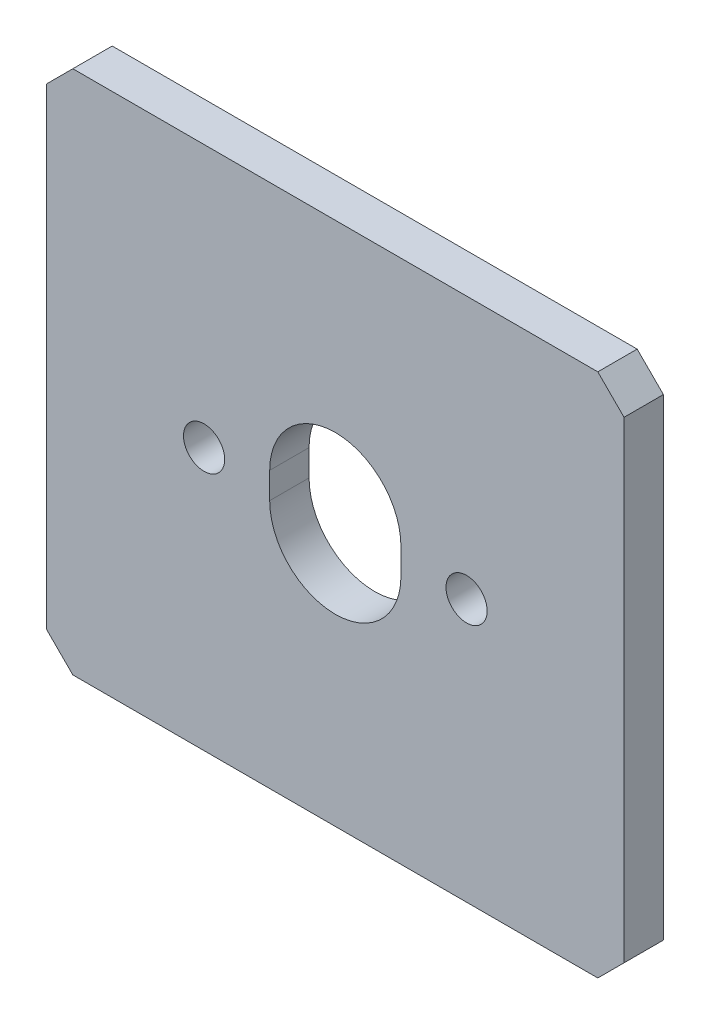
ISO-10303-21;
HEADER;
FILE_DESCRIPTION(('STEP AP214'),'2;1');
FILE_NAME('part.step','',(''),(''),'','','');
FILE_SCHEMA(('AUTOMOTIVE_DESIGN { 1 0 10303 214 1 1 1 1 }'));
ENDSEC;
DATA;
#1=APPLICATION_CONTEXT('core data for automotive mechanical design processes');
#2=APPLICATION_PROTOCOL_DEFINITION('international standard','automotive_design',2000,#1);
#3=PRODUCT_CONTEXT('',#1,'mechanical');
#4=PRODUCT('Part','Part','',(#3));
#5=PRODUCT_RELATED_PRODUCT_CATEGORY('part','',(#4));
#6=PRODUCT_DEFINITION_FORMATION('','',#4);
#7=PRODUCT_DEFINITION_CONTEXT('part definition',#1,'design');
#8=PRODUCT_DEFINITION('design','',#6,#7);
#9=PRODUCT_DEFINITION_SHAPE('','',#8);
#10=(LENGTH_UNIT() NAMED_UNIT(*) SI_UNIT(.MILLI.,.METRE.));
#11=(NAMED_UNIT(*) PLANE_ANGLE_UNIT() SI_UNIT($,.RADIAN.));
#12=(NAMED_UNIT(*) SI_UNIT($,.STERADIAN.) SOLID_ANGLE_UNIT());
#13=UNCERTAINTY_MEASURE_WITH_UNIT(LENGTH_MEASURE(1.E-05),#10,'distance_accuracy_value','');
#14=(GEOMETRIC_REPRESENTATION_CONTEXT(3) GLOBAL_UNCERTAINTY_ASSIGNED_CONTEXT((#13)) GLOBAL_UNIT_ASSIGNED_CONTEXT((#10,
#11,#12)) REPRESENTATION_CONTEXT('',''));
#15=CARTESIAN_POINT('',(0.,0.,0.));
#16=DIRECTION('',(0.,0.,1.));
#17=DIRECTION('',(1.,0.,0.));
#18=AXIS2_PLACEMENT_3D('',#15,#16,#17);
#19=CARTESIAN_POINT('',(0.,0.,-4.7625));
#20=DIRECTION('',(0.,0.,1.));
#21=DIRECTION('',(-1.,0.,0.));
#22=AXIS2_PLACEMENT_3D('',#19,#20,#21);
#23=PLANE('',#22);
#24=DIRECTION('',(0.,-1.,0.));
#25=VECTOR('',#24,1.);
#26=CARTESIAN_POINT('',(-34.925,-31.75,-4.7625));
#27=LINE('',#26,#25);
#28=CARTESIAN_POINT('',(-34.925,28.575,-4.7625));
#29=VERTEX_POINT('',#28);
#30=CARTESIAN_POINT('',(-34.925,-28.575,-4.7625));
#31=VERTEX_POINT('',#30);
#32=EDGE_CURVE('E177',#29,#31,#27,.T.);
#33=ORIENTED_EDGE('',*,*,#32,.F.);
#34=DIRECTION('',(0.707106781186549,0.707106781186546,0.));
#35=VECTOR('',#34,1.);
#36=CARTESIAN_POINT('',(-34.925,28.575,-4.7625));
#37=LINE('',#36,#35);
#38=CARTESIAN_POINT('',(-31.75,31.75,-4.7625));
#39=VERTEX_POINT('',#38);
#40=EDGE_CURVE('E214',#39,#29,#37,.F.);
#41=ORIENTED_EDGE('',*,*,#40,.F.);
#42=DIRECTION('',(-1.,0.,0.));
#43=VECTOR('',#42,1.);
#44=CARTESIAN_POINT('',(-34.925,31.75,-4.7625));
#45=LINE('',#44,#43);
#46=CARTESIAN_POINT('',(31.75,31.75,-4.7625));
#47=VERTEX_POINT('',#46);
#48=EDGE_CURVE('E174',#47,#39,#45,.T.);
#49=ORIENTED_EDGE('',*,*,#48,.F.);
#50=DIRECTION('',(0.707106781186548,-0.707106781186548,0.));
#51=VECTOR('',#50,1.);
#52=CARTESIAN_POINT('',(31.75,31.75,-4.7625));
#53=LINE('',#52,#51);
#54=CARTESIAN_POINT('',(34.925,28.575,-4.7625));
#55=VERTEX_POINT('',#54);
#56=EDGE_CURVE('E212',#55,#47,#53,.F.);
#57=ORIENTED_EDGE('',*,*,#56,.F.);
#58=DIRECTION('',(0.,1.,0.));
#59=VECTOR('',#58,1.);
#60=CARTESIAN_POINT('',(34.925,-31.75,-4.7625));
#61=LINE('',#60,#59);
#62=CARTESIAN_POINT('',(34.925,-28.575,-4.7625));
#63=VERTEX_POINT('',#62);
#64=EDGE_CURVE('E171',#63,#55,#61,.T.);
#65=ORIENTED_EDGE('',*,*,#64,.F.);
#66=DIRECTION('',(-0.707106781186551,-0.707106781186544,0.));
#67=VECTOR('',#66,1.);
#68=CARTESIAN_POINT('',(34.925,-28.575,-4.7625));
#69=LINE('',#68,#67);
#70=CARTESIAN_POINT('',(31.75,-31.75,-4.7625));
#71=VERTEX_POINT('',#70);
#72=EDGE_CURVE('E216',#71,#63,#69,.F.);
#73=ORIENTED_EDGE('',*,*,#72,.F.);
#74=DIRECTION('',(1.,0.,0.));
#75=VECTOR('',#74,1.);
#76=CARTESIAN_POINT('',(-34.925,-31.75,-4.7625));
#77=LINE('',#76,#75);
#78=CARTESIAN_POINT('',(-31.75,-31.75,-4.7625));
#79=VERTEX_POINT('',#78);
#80=EDGE_CURVE('E180',#79,#71,#77,.T.);
#81=ORIENTED_EDGE('',*,*,#80,.F.);
#82=DIRECTION('',(-0.707106781186546,0.707106781186549,0.));
#83=VECTOR('',#82,1.);
#84=CARTESIAN_POINT('',(-31.75,-31.75,-4.7625));
#85=LINE('',#84,#83);
#86=EDGE_CURVE('E219',#31,#79,#85,.F.);
#87=ORIENTED_EDGE('',*,*,#86,.F.);
#88=EDGE_LOOP('',(#33,#41,#49,#57,#65,#73,#81,#87));
#89=FACE_BOUND('',#88,.T.);
#90=CARTESIAN_POINT('',(0.,1.5875,-4.7625));
#91=DIRECTION('',(0.,0.,1.));
#92=DIRECTION('',(1.,0.,0.));
#93=AXIS2_PLACEMENT_3D('',#90,#91,#92);
#94=CIRCLE('',#93,7.9375);
#95=CARTESIAN_POINT('',(7.9375,1.5875,-4.7625));
#96=VERTEX_POINT('',#95);
#97=CARTESIAN_POINT('',(-7.9375,1.5875,-4.7625));
#98=VERTEX_POINT('',#97);
#99=EDGE_CURVE('E128',#96,#98,#94,.T.);
#100=ORIENTED_EDGE('',*,*,#99,.T.);
#101=DIRECTION('',(0.,-1.,0.));
#102=VECTOR('',#101,1.);
#103=CARTESIAN_POINT('',(-7.9375,1.5875,-4.7625));
#104=LINE('',#103,#102);
#105=CARTESIAN_POINT('',(-7.9375,-1.5875,-4.7625));
#106=VERTEX_POINT('',#105);
#107=EDGE_CURVE('E138',#98,#106,#104,.T.);
#108=ORIENTED_EDGE('',*,*,#107,.T.);
#109=CARTESIAN_POINT('',(0.,-1.5875,-4.7625));
#110=DIRECTION('',(0.,0.,1.));
#111=DIRECTION('',(1.,0.,0.));
#112=AXIS2_PLACEMENT_3D('',#109,#110,#111);
#113=CIRCLE('',#112,7.9375);
#114=CARTESIAN_POINT('',(7.9375,-1.5875,-4.7625));
#115=VERTEX_POINT('',#114);
#116=EDGE_CURVE('E143',#106,#115,#113,.T.);
#117=ORIENTED_EDGE('',*,*,#116,.T.);
#118=DIRECTION('',(0.,1.,0.));
#119=VECTOR('',#118,1.);
#120=CARTESIAN_POINT('',(7.9375,1.5875,-4.7625));
#121=LINE('',#120,#119);
#122=EDGE_CURVE('E148',#115,#96,#121,.T.);
#123=ORIENTED_EDGE('',*,*,#122,.T.);
#124=EDGE_LOOP('',(#100,#108,#117,#123));
#125=FACE_BOUND('',#124,.T.);
#126=CARTESIAN_POINT('',(-15.875,0.,-4.7625));
#127=DIRECTION('',(0.,0.,1.));
#128=DIRECTION('',(1.,0.,0.));
#129=AXIS2_PLACEMENT_3D('',#126,#127,#128);
#130=CIRCLE('',#129,2.4892);
#131=CARTESIAN_POINT('',(-18.3642,0.,-4.7625));
#132=VERTEX_POINT('',#131);
#133=EDGE_CURVE('E163',#132,#132,#130,.T.);
#134=ORIENTED_EDGE('',*,*,#133,.T.);
#135=EDGE_LOOP('',(#134));
#136=FACE_BOUND('',#135,.T.);
#137=CARTESIAN_POINT('',(15.875,0.,-4.7625));
#138=DIRECTION('',(0.,0.,1.));
#139=DIRECTION('',(1.,0.,0.));
#140=AXIS2_PLACEMENT_3D('',#137,#138,#139);
#141=CIRCLE('',#140,2.4892);
#142=CARTESIAN_POINT('',(13.3858,0.,-4.7625));
#143=VERTEX_POINT('',#142);
#144=EDGE_CURVE('E397',#143,#143,#141,.T.);
#145=ORIENTED_EDGE('',*,*,#144,.T.);
#146=EDGE_LOOP('',(#145));
#147=FACE_BOUND('',#146,.T.);
#148=ADVANCED_FACE('F37',(#89,#125,#136,#147),#23,.F.);
#149=CARTESIAN_POINT('',(0.,0.,0.));
#150=DIRECTION('',(0.,0.,1.));
#151=DIRECTION('',(-1.,0.,0.));
#152=AXIS2_PLACEMENT_3D('',#149,#150,#151);
#153=PLANE('',#152);
#154=CARTESIAN_POINT('',(-15.875,0.,0.));
#155=DIRECTION('',(0.,0.,1.));
#156=DIRECTION('',(1.,0.,0.));
#157=AXIS2_PLACEMENT_3D('',#154,#155,#156);
#158=CIRCLE('',#157,2.4892);
#159=CARTESIAN_POINT('',(-18.3642,0.,0.));
#160=VERTEX_POINT('',#159);
#161=EDGE_CURVE('E155',#160,#160,#158,.T.);
#162=ORIENTED_EDGE('',*,*,#161,.F.);
#163=EDGE_LOOP('',(#162));
#164=FACE_BOUND('',#163,.T.);
#165=DIRECTION('',(1.,0.,0.));
#166=VECTOR('',#165,1.);
#167=CARTESIAN_POINT('',(-34.925,-31.75,0.));
#168=LINE('',#167,#166);
#169=CARTESIAN_POINT('',(-31.75,-31.75,0.));
#170=VERTEX_POINT('',#169);
#171=CARTESIAN_POINT('',(31.75,-31.75,0.));
#172=VERTEX_POINT('',#171);
#173=EDGE_CURVE('E175',#170,#172,#168,.T.);
#174=ORIENTED_EDGE('',*,*,#173,.T.);
#175=DIRECTION('',(0.707106781186551,0.707106781186544,0.));
#176=VECTOR('',#175,1.);
#177=CARTESIAN_POINT('',(31.7499999999999,-31.7500000000001,0.));
#178=LINE('',#177,#176);
#179=CARTESIAN_POINT('',(34.925,-28.575,0.));
#180=VERTEX_POINT('',#179);
#181=EDGE_CURVE('E202',#180,#172,#178,.F.);
#182=ORIENTED_EDGE('',*,*,#181,.F.);
#183=DIRECTION('',(0.,1.,0.));
#184=VECTOR('',#183,1.);
#185=CARTESIAN_POINT('',(34.925,-31.75,0.));
#186=LINE('',#185,#184);
#187=CARTESIAN_POINT('',(34.925,28.575,0.));
#188=VERTEX_POINT('',#187);
#189=EDGE_CURVE('E134',#180,#188,#186,.T.);
#190=ORIENTED_EDGE('',*,*,#189,.T.);
#191=DIRECTION('',(-0.707106781186548,0.707106781186548,0.));
#192=VECTOR('',#191,1.);
#193=CARTESIAN_POINT('',(31.75,31.75,0.));
#194=LINE('',#193,#192);
#195=CARTESIAN_POINT('',(31.75,31.75,0.));
#196=VERTEX_POINT('',#195);
#197=EDGE_CURVE('E197',#196,#188,#194,.F.);
#198=ORIENTED_EDGE('',*,*,#197,.F.);
#199=DIRECTION('',(-1.,0.,0.));
#200=VECTOR('',#199,1.);
#201=CARTESIAN_POINT('',(-34.925,31.75,0.));
#202=LINE('',#201,#200);
#203=CARTESIAN_POINT('',(-31.75,31.75,0.));
#204=VERTEX_POINT('',#203);
#205=EDGE_CURVE('E186',#196,#204,#202,.T.);
#206=ORIENTED_EDGE('',*,*,#205,.T.);
#207=DIRECTION('',(-0.707106781186549,-0.707106781186546,0.));
#208=VECTOR('',#207,1.);
#209=CARTESIAN_POINT('',(-31.7499999999999,31.7500000000001,0.));
#210=LINE('',#209,#208);
#211=CARTESIAN_POINT('',(-34.925,28.575,0.));
#212=VERTEX_POINT('',#211);
#213=EDGE_CURVE('E200',#212,#204,#210,.F.);
#214=ORIENTED_EDGE('',*,*,#213,.F.);
#215=DIRECTION('',(0.,-1.,0.));
#216=VECTOR('',#215,1.);
#217=CARTESIAN_POINT('',(-34.925,-31.75,0.));
#218=LINE('',#217,#216);
#219=CARTESIAN_POINT('',(-34.925,-28.575,0.));
#220=VERTEX_POINT('',#219);
#221=EDGE_CURVE('E189',#212,#220,#218,.T.);
#222=ORIENTED_EDGE('',*,*,#221,.T.);
#223=DIRECTION('',(0.707106781186546,-0.707106781186549,0.));
#224=VECTOR('',#223,1.);
#225=CARTESIAN_POINT('',(-31.7500000000001,-31.7499999999999,0.));
#226=LINE('',#225,#224);
#227=EDGE_CURVE('E205',#170,#220,#226,.F.);
#228=ORIENTED_EDGE('',*,*,#227,.F.);
#229=EDGE_LOOP('',(#174,#182,#190,#198,#206,#214,#222,#228));
#230=FACE_BOUND('',#229,.T.);
#231=DIRECTION('',(0.,1.,0.));
#232=VECTOR('',#231,1.);
#233=CARTESIAN_POINT('',(7.9375,1.5875,0.));
#234=LINE('',#233,#232);
#235=CARTESIAN_POINT('',(7.9375,-1.5875,0.));
#236=VERTEX_POINT('',#235);
#237=CARTESIAN_POINT('',(7.9375,1.5875,0.));
#238=VERTEX_POINT('',#237);
#239=EDGE_CURVE('E149',#236,#238,#234,.T.);
#240=ORIENTED_EDGE('',*,*,#239,.F.);
#241=CARTESIAN_POINT('',(0.,-1.5875,0.));
#242=DIRECTION('',(0.,0.,1.));
#243=DIRECTION('',(1.,0.,0.));
#244=AXIS2_PLACEMENT_3D('',#241,#242,#243);
#245=CIRCLE('',#244,7.9375);
#246=CARTESIAN_POINT('',(-7.9375,-1.5875,0.));
#247=VERTEX_POINT('',#246);
#248=EDGE_CURVE('E152',#247,#236,#245,.T.);
#249=ORIENTED_EDGE('',*,*,#248,.F.);
#250=DIRECTION('',(0.,-1.,0.));
#251=VECTOR('',#250,1.);
#252=CARTESIAN_POINT('',(-7.9375,1.5875,0.));
#253=LINE('',#252,#251);
#254=CARTESIAN_POINT('',(-7.9375,1.5875,0.));
#255=VERTEX_POINT('',#254);
#256=EDGE_CURVE('E162',#255,#247,#253,.T.);
#257=ORIENTED_EDGE('',*,*,#256,.F.);
#258=CARTESIAN_POINT('',(0.,1.5875,0.));
#259=DIRECTION('',(0.,0.,1.));
#260=DIRECTION('',(1.,0.,0.));
#261=AXIS2_PLACEMENT_3D('',#258,#259,#260);
#262=CIRCLE('',#261,7.9375);
#263=EDGE_CURVE('E130',#238,#255,#262,.T.);
#264=ORIENTED_EDGE('',*,*,#263,.F.);
#265=EDGE_LOOP('',(#240,#249,#257,#264));
#266=FACE_BOUND('',#265,.T.);
#267=CARTESIAN_POINT('',(15.875,0.,0.));
#268=DIRECTION('',(0.,0.,1.));
#269=DIRECTION('',(1.,0.,0.));
#270=AXIS2_PLACEMENT_3D('',#267,#268,#269);
#271=CIRCLE('',#270,2.4892);
#272=CARTESIAN_POINT('',(13.3858,0.,0.));
#273=VERTEX_POINT('',#272);
#274=EDGE_CURVE('E399',#273,#273,#271,.T.);
#275=ORIENTED_EDGE('',*,*,#274,.F.);
#276=EDGE_LOOP('',(#275));
#277=FACE_BOUND('',#276,.T.);
#278=ADVANCED_FACE('F232',(#164,#230,#266,#277),#153,.T.);
#279=CARTESIAN_POINT('',(34.925,-31.75,-4.7625));
#280=DIRECTION('',(-1.,0.,0.));
#281=DIRECTION('',(0.,0.,-1.));
#282=AXIS2_PLACEMENT_3D('',#279,#280,#281);
#283=PLANE('',#282);
#284=ORIENTED_EDGE('',*,*,#64,.T.);
#285=DIRECTION('',(0.,0.,-1.));
#286=VECTOR('',#285,1.);
#287=CARTESIAN_POINT('',(34.925,28.575,-4.7625));
#288=LINE('',#287,#286);
#289=EDGE_CURVE('E222',#188,#55,#288,.T.);
#290=ORIENTED_EDGE('',*,*,#289,.F.);
#291=ORIENTED_EDGE('',*,*,#189,.F.);
#292=DIRECTION('',(0.,0.,1.));
#293=VECTOR('',#292,1.);
#294=CARTESIAN_POINT('',(34.925,-28.575,-4.7625));
#295=LINE('',#294,#293);
#296=EDGE_CURVE('E224',#63,#180,#295,.T.);
#297=ORIENTED_EDGE('',*,*,#296,.F.);
#298=EDGE_LOOP('',(#284,#290,#291,#297));
#299=FACE_BOUND('',#298,.T.);
#300=ADVANCED_FACE('F237',(#299),#283,.F.);
#301=CARTESIAN_POINT('',(-34.925,31.75,-4.7625));
#302=DIRECTION('',(0.,-1.,0.));
#303=DIRECTION('',(0.,0.,1.));
#304=AXIS2_PLACEMENT_3D('',#301,#302,#303);
#305=PLANE('',#304);
#306=ORIENTED_EDGE('',*,*,#205,.F.);
#307=DIRECTION('',(0.,0.,1.));
#308=VECTOR('',#307,1.);
#309=CARTESIAN_POINT('',(31.75,31.75,-4.7625));
#310=LINE('',#309,#308);
#311=EDGE_CURVE('E45',#47,#196,#310,.T.);
#312=ORIENTED_EDGE('',*,*,#311,.F.);
#313=ORIENTED_EDGE('',*,*,#48,.T.);
#314=DIRECTION('',(0.,0.,-1.));
#315=VECTOR('',#314,1.);
#316=CARTESIAN_POINT('',(-31.75,31.75,-4.7625));
#317=LINE('',#316,#315);
#318=EDGE_CURVE('E11',#204,#39,#317,.T.);
#319=ORIENTED_EDGE('',*,*,#318,.F.);
#320=EDGE_LOOP('',(#306,#312,#313,#319));
#321=FACE_BOUND('',#320,.T.);
#322=ADVANCED_FACE('F229',(#321),#305,.F.);
#323=CARTESIAN_POINT('',(-34.925,-31.75,-4.7625));
#324=DIRECTION('',(1.,0.,0.));
#325=DIRECTION('',(0.,0.,1.));
#326=AXIS2_PLACEMENT_3D('',#323,#324,#325);
#327=PLANE('',#326);
#328=ORIENTED_EDGE('',*,*,#221,.F.);
#329=DIRECTION('',(0.,0.,1.));
#330=VECTOR('',#329,1.);
#331=CARTESIAN_POINT('',(-34.925,28.575,-4.7625));
#332=LINE('',#331,#330);
#333=EDGE_CURVE('E208',#29,#212,#332,.T.);
#334=ORIENTED_EDGE('',*,*,#333,.F.);
#335=ORIENTED_EDGE('',*,*,#32,.T.);
#336=DIRECTION('',(0.,0.,-1.));
#337=VECTOR('',#336,1.);
#338=CARTESIAN_POINT('',(-34.925,-28.575,-4.7625));
#339=LINE('',#338,#337);
#340=EDGE_CURVE('E210',#220,#31,#339,.T.);
#341=ORIENTED_EDGE('',*,*,#340,.F.);
#342=EDGE_LOOP('',(#328,#334,#335,#341));
#343=FACE_BOUND('',#342,.T.);
#344=ADVANCED_FACE('F247',(#343),#327,.F.);
#345=CARTESIAN_POINT('',(-34.925,-31.75,-4.7625));
#346=DIRECTION('',(0.,1.,0.));
#347=DIRECTION('',(0.,0.,-1.));
#348=AXIS2_PLACEMENT_3D('',#345,#346,#347);
#349=PLANE('',#348);
#350=ORIENTED_EDGE('',*,*,#80,.T.);
#351=DIRECTION('',(0.,0.,-1.));
#352=VECTOR('',#351,1.);
#353=CARTESIAN_POINT('',(31.75,-31.75,-4.7625));
#354=LINE('',#353,#352);
#355=EDGE_CURVE('E183',#172,#71,#354,.T.);
#356=ORIENTED_EDGE('',*,*,#355,.F.);
#357=ORIENTED_EDGE('',*,*,#173,.F.);
#358=DIRECTION('',(0.,0.,1.));
#359=VECTOR('',#358,1.);
#360=CARTESIAN_POINT('',(-31.75,-31.75,-4.7625));
#361=LINE('',#360,#359);
#362=EDGE_CURVE('E195',#79,#170,#361,.T.);
#363=ORIENTED_EDGE('',*,*,#362,.F.);
#364=EDGE_LOOP('',(#350,#356,#357,#363));
#365=FACE_BOUND('',#364,.T.);
#366=ADVANCED_FACE('F252',(#365),#349,.F.);
#367=CARTESIAN_POINT('',(0.,1.5875,-4.7625));
#368=DIRECTION('',(0.,0.,1.));
#369=DIRECTION('',(-1.,0.,0.));
#370=AXIS2_PLACEMENT_3D('',#367,#368,#369);
#371=CYLINDRICAL_SURFACE('',#370,7.9375);
#372=ORIENTED_EDGE('',*,*,#263,.T.);
#373=DIRECTION('',(0.,0.,1.));
#374=VECTOR('',#373,1.);
#375=CARTESIAN_POINT('',(-7.9375,1.5875,-4.7625));
#376=LINE('',#375,#374);
#377=EDGE_CURVE('E124',#98,#255,#376,.T.);
#378=ORIENTED_EDGE('',*,*,#377,.F.);
#379=ORIENTED_EDGE('',*,*,#99,.F.);
#380=DIRECTION('',(0.,0.,1.));
#381=VECTOR('',#380,1.);
#382=CARTESIAN_POINT('',(7.9375,1.5875,-4.7625));
#383=LINE('',#382,#381);
#384=EDGE_CURVE('E160',#96,#238,#383,.T.);
#385=ORIENTED_EDGE('',*,*,#384,.T.);
#386=EDGE_LOOP('',(#372,#378,#379,#385));
#387=FACE_BOUND('',#386,.T.);
#388=ADVANCED_FACE('F126',(#387),#371,.F.);
#389=CARTESIAN_POINT('',(-7.9375,1.5875,-4.7625));
#390=DIRECTION('',(1.,0.,0.));
#391=DIRECTION('',(0.,0.,1.));
#392=AXIS2_PLACEMENT_3D('',#389,#390,#391);
#393=PLANE('',#392);
#394=ORIENTED_EDGE('',*,*,#256,.T.);
#395=DIRECTION('',(0.,0.,1.));
#396=VECTOR('',#395,1.);
#397=CARTESIAN_POINT('',(-7.9375,-1.5875,-4.7625));
#398=LINE('',#397,#396);
#399=EDGE_CURVE('E135',#106,#247,#398,.T.);
#400=ORIENTED_EDGE('',*,*,#399,.F.);
#401=ORIENTED_EDGE('',*,*,#107,.F.);
#402=ORIENTED_EDGE('',*,*,#377,.T.);
#403=EDGE_LOOP('',(#394,#400,#401,#402));
#404=FACE_BOUND('',#403,.T.);
#405=ADVANCED_FACE('F139',(#404),#393,.T.);
#406=CARTESIAN_POINT('',(0.,-1.5875,-4.7625));
#407=DIRECTION('',(0.,0.,1.));
#408=DIRECTION('',(-1.,0.,0.));
#409=AXIS2_PLACEMENT_3D('',#406,#407,#408);
#410=CYLINDRICAL_SURFACE('',#409,7.9375);
#411=ORIENTED_EDGE('',*,*,#248,.T.);
#412=DIRECTION('',(0.,0.,1.));
#413=VECTOR('',#412,1.);
#414=CARTESIAN_POINT('',(7.9375,-1.5875,-4.7625));
#415=LINE('',#414,#413);
#416=EDGE_CURVE('E168',#115,#236,#415,.T.);
#417=ORIENTED_EDGE('',*,*,#416,.F.);
#418=ORIENTED_EDGE('',*,*,#116,.F.);
#419=ORIENTED_EDGE('',*,*,#399,.T.);
#420=EDGE_LOOP('',(#411,#417,#418,#419));
#421=FACE_BOUND('',#420,.T.);
#422=ADVANCED_FACE('F317',(#421),#410,.F.);
#423=CARTESIAN_POINT('',(7.9375,1.5875,-4.7625));
#424=DIRECTION('',(-1.,0.,0.));
#425=DIRECTION('',(0.,0.,-1.));
#426=AXIS2_PLACEMENT_3D('',#423,#424,#425);
#427=PLANE('',#426);
#428=ORIENTED_EDGE('',*,*,#239,.T.);
#429=ORIENTED_EDGE('',*,*,#384,.F.);
#430=ORIENTED_EDGE('',*,*,#122,.F.);
#431=ORIENTED_EDGE('',*,*,#416,.T.);
#432=EDGE_LOOP('',(#428,#429,#430,#431));
#433=FACE_BOUND('',#432,.T.);
#434=ADVANCED_FACE('F324',(#433),#427,.T.);
#435=CARTESIAN_POINT('',(-15.875,0.,-4.7625));
#436=DIRECTION('',(0.,0.,1.));
#437=DIRECTION('',(-1.,0.,0.));
#438=AXIS2_PLACEMENT_3D('',#435,#436,#437);
#439=CYLINDRICAL_SURFACE('',#438,2.4892);
#440=CARTESIAN_POINT('',(-18.3642,0.,-4.7625));
#441=CARTESIAN_POINT('',(-18.3642,0.,-4.712890625));
#442=CARTESIAN_POINT('',(-18.3642,0.,-4.66328125));
#443=CARTESIAN_POINT('',(-18.3642,0.,-4.5640625));
#444=CARTESIAN_POINT('',(-18.3642,0.,-4.514453125));
#445=CARTESIAN_POINT('',(-18.3642,0.,-4.415234375));
#446=CARTESIAN_POINT('',(-18.3642,0.,-4.365625));
#447=CARTESIAN_POINT('',(-18.3642,0.,-4.26640625));
#448=CARTESIAN_POINT('',(-18.3642,0.,-4.216796875));
#449=CARTESIAN_POINT('',(-18.3642,0.,-4.117578125));
#450=CARTESIAN_POINT('',(-18.3642,0.,-4.06796875));
#451=CARTESIAN_POINT('',(-18.3642,0.,-3.96875));
#452=CARTESIAN_POINT('',(-18.3642,0.,-3.919140625));
#453=CARTESIAN_POINT('',(-18.3642,0.,-3.819921875));
#454=CARTESIAN_POINT('',(-18.3642,0.,-3.7703125));
#455=CARTESIAN_POINT('',(-18.3642,0.,-3.67109375));
#456=CARTESIAN_POINT('',(-18.3642,0.,-3.621484375));
#457=CARTESIAN_POINT('',(-18.3642,0.,-3.522265625));
#458=CARTESIAN_POINT('',(-18.3642,0.,-3.47265625));
#459=CARTESIAN_POINT('',(-18.3642,0.,-3.3734375));
#460=CARTESIAN_POINT('',(-18.3642,0.,-3.323828125));
#461=CARTESIAN_POINT('',(-18.3642,0.,-3.224609375));
#462=CARTESIAN_POINT('',(-18.3642,0.,-3.175));
#463=CARTESIAN_POINT('',(-18.3642,0.,-3.07578125));
#464=CARTESIAN_POINT('',(-18.3642,0.,-3.026171875));
#465=CARTESIAN_POINT('',(-18.3642,0.,-2.926953125));
#466=CARTESIAN_POINT('',(-18.3642,0.,-2.87734375));
#467=CARTESIAN_POINT('',(-18.3642,0.,-2.778125));
#468=CARTESIAN_POINT('',(-18.3642,0.,-2.728515625));
#469=CARTESIAN_POINT('',(-18.3642,0.,-2.629296875));
#470=CARTESIAN_POINT('',(-18.3642,0.,-2.5796875));
#471=CARTESIAN_POINT('',(-18.3642,0.,-2.48046875));
#472=CARTESIAN_POINT('',(-18.3642,0.,-2.430859375));
#473=CARTESIAN_POINT('',(-18.3642,0.,-2.331640625));
#474=CARTESIAN_POINT('',(-18.3642,0.,-2.28203125));
#475=CARTESIAN_POINT('',(-18.3642,0.,-2.1828125));
#476=CARTESIAN_POINT('',(-18.3642,0.,-2.133203125));
#477=CARTESIAN_POINT('',(-18.3642,0.,-2.033984375));
#478=CARTESIAN_POINT('',(-18.3642,0.,-1.984375));
#479=CARTESIAN_POINT('',(-18.3642,0.,-1.88515625));
#480=CARTESIAN_POINT('',(-18.3642,0.,-1.835546875));
#481=CARTESIAN_POINT('',(-18.3642,0.,-1.736328125));
#482=CARTESIAN_POINT('',(-18.3642,0.,-1.68671875));
#483=CARTESIAN_POINT('',(-18.3642,0.,-1.5875));
#484=CARTESIAN_POINT('',(-18.3642,0.,-1.537890625));
#485=CARTESIAN_POINT('',(-18.3642,0.,-1.438671875));
#486=CARTESIAN_POINT('',(-18.3642,0.,-1.3890625));
#487=CARTESIAN_POINT('',(-18.3642,0.,-1.28984375));
#488=CARTESIAN_POINT('',(-18.3642,0.,-1.240234375));
#489=CARTESIAN_POINT('',(-18.3642,0.,-1.141015625));
#490=CARTESIAN_POINT('',(-18.3642,0.,-1.09140625));
#491=CARTESIAN_POINT('',(-18.3642,0.,-0.9921875));
#492=CARTESIAN_POINT('',(-18.3642,0.,-0.942578125));
#493=CARTESIAN_POINT('',(-18.3642,0.,-0.843359375));
#494=CARTESIAN_POINT('',(-18.3642,0.,-0.79375));
#495=CARTESIAN_POINT('',(-18.3642,0.,-0.69453125));
#496=CARTESIAN_POINT('',(-18.3642,0.,-0.644921875));
#497=CARTESIAN_POINT('',(-18.3642,0.,-0.545703125));
#498=CARTESIAN_POINT('',(-18.3642,0.,-0.49609375));
#499=CARTESIAN_POINT('',(-18.3642,0.,-0.396875));
#500=CARTESIAN_POINT('',(-18.3642,0.,-0.347265625));
#501=CARTESIAN_POINT('',(-18.3642,0.,-0.248046875));
#502=CARTESIAN_POINT('',(-18.3642,0.,-0.1984375));
#503=CARTESIAN_POINT('',(-18.3642,0.,-0.09921875));
#504=CARTESIAN_POINT('',(-18.3642,0.,-0.049609375));
#505=CARTESIAN_POINT('',(-18.3642,0.,0.));
#506=B_SPLINE_CURVE_WITH_KNOTS('',3,(#440,#441,#442,#443,#444,#445,#446,#447,#448,#449,#450,
#451,#452,#453,#454,#455,#456,#457,#458,#459,#460,#461,#462,#463,#464,#465,#466,#467,#468,#469,
#470,#471,#472,#473,#474,#475,#476,#477,#478,#479,#480,#481,#482,#483,#484,#485,#486,#487,#488,
#489,#490,#491,#492,#493,#494,#495,#496,#497,#498,#499,#500,#501,#502,#503,#504,#505),
.UNSPECIFIED.,.F.,.F.,(4,2,2,2,2,2,2,2,2,2,2,2,2,2,2,2,2,2,2,2,2,2,2,2,2,2,2,2,2,2,2,2,4),(0.,
0.148828125,0.29765625,0.446484375,0.5953125,0.744140625,0.892968750000001,1.041796875,1.190625,
1.339453125,1.48828125,1.637109375,1.7859375,1.934765625,2.08359375,2.232421875,2.38125,
2.530078125,2.67890625,2.827734375,2.9765625,3.125390625,3.27421875,3.423046875,3.571875,
3.720703125,3.86953125,4.018359375,4.1671875,4.316015625,4.46484375,4.613671875,4.7625),.UNSPECIFIED.);
#507=EDGE_CURVE('BSEAM265',#132,#160,#506,.T.);
#508=ORIENTED_EDGE('',*,*,#133,.F.);
#509=ORIENTED_EDGE('',*,*,#161,.T.);
#510=ORIENTED_EDGE('',*,*,#507,.T.);
#511=ORIENTED_EDGE('',*,*,#507,.F.);
#512=EDGE_LOOP('',(#508,#510,#509,#511));
#513=FACE_BOUND('',#512,.T.);
#514=ADVANCED_FACE('F265',(#513),#439,.F.);
#515=CARTESIAN_POINT('',(15.875,0.,-4.7625));
#516=DIRECTION('',(0.,0.,1.));
#517=DIRECTION('',(-1.,0.,0.));
#518=AXIS2_PLACEMENT_3D('',#515,#516,#517);
#519=CYLINDRICAL_SURFACE('',#518,2.4892);
#520=CARTESIAN_POINT('',(13.3858,0.,-4.7625));
#521=CARTESIAN_POINT('',(13.3858,0.,-4.712890625));
#522=CARTESIAN_POINT('',(13.3858,0.,-4.66328125));
#523=CARTESIAN_POINT('',(13.3858,0.,-4.5640625));
#524=CARTESIAN_POINT('',(13.3858,0.,-4.514453125));
#525=CARTESIAN_POINT('',(13.3858,0.,-4.415234375));
#526=CARTESIAN_POINT('',(13.3858,0.,-4.365625));
#527=CARTESIAN_POINT('',(13.3858,0.,-4.26640625));
#528=CARTESIAN_POINT('',(13.3858,0.,-4.216796875));
#529=CARTESIAN_POINT('',(13.3858,0.,-4.117578125));
#530=CARTESIAN_POINT('',(13.3858,0.,-4.06796875));
#531=CARTESIAN_POINT('',(13.3858,0.,-3.96875));
#532=CARTESIAN_POINT('',(13.3858,0.,-3.919140625));
#533=CARTESIAN_POINT('',(13.3858,0.,-3.819921875));
#534=CARTESIAN_POINT('',(13.3858,0.,-3.7703125));
#535=CARTESIAN_POINT('',(13.3858,0.,-3.67109375));
#536=CARTESIAN_POINT('',(13.3858,0.,-3.621484375));
#537=CARTESIAN_POINT('',(13.3858,0.,-3.522265625));
#538=CARTESIAN_POINT('',(13.3858,0.,-3.47265625));
#539=CARTESIAN_POINT('',(13.3858,0.,-3.3734375));
#540=CARTESIAN_POINT('',(13.3858,0.,-3.323828125));
#541=CARTESIAN_POINT('',(13.3858,0.,-3.224609375));
#542=CARTESIAN_POINT('',(13.3858,0.,-3.175));
#543=CARTESIAN_POINT('',(13.3858,0.,-3.07578125));
#544=CARTESIAN_POINT('',(13.3858,0.,-3.026171875));
#545=CARTESIAN_POINT('',(13.3858,0.,-2.926953125));
#546=CARTESIAN_POINT('',(13.3858,0.,-2.87734375));
#547=CARTESIAN_POINT('',(13.3858,0.,-2.778125));
#548=CARTESIAN_POINT('',(13.3858,0.,-2.728515625));
#549=CARTESIAN_POINT('',(13.3858,0.,-2.629296875));
#550=CARTESIAN_POINT('',(13.3858,0.,-2.5796875));
#551=CARTESIAN_POINT('',(13.3858,0.,-2.48046875));
#552=CARTESIAN_POINT('',(13.3858,0.,-2.430859375));
#553=CARTESIAN_POINT('',(13.3858,0.,-2.331640625));
#554=CARTESIAN_POINT('',(13.3858,0.,-2.28203125));
#555=CARTESIAN_POINT('',(13.3858,0.,-2.1828125));
#556=CARTESIAN_POINT('',(13.3858,0.,-2.133203125));
#557=CARTESIAN_POINT('',(13.3858,0.,-2.033984375));
#558=CARTESIAN_POINT('',(13.3858,0.,-1.984375));
#559=CARTESIAN_POINT('',(13.3858,0.,-1.88515625));
#560=CARTESIAN_POINT('',(13.3858,0.,-1.835546875));
#561=CARTESIAN_POINT('',(13.3858,0.,-1.736328125));
#562=CARTESIAN_POINT('',(13.3858,0.,-1.68671875));
#563=CARTESIAN_POINT('',(13.3858,0.,-1.5875));
#564=CARTESIAN_POINT('',(13.3858,0.,-1.537890625));
#565=CARTESIAN_POINT('',(13.3858,0.,-1.438671875));
#566=CARTESIAN_POINT('',(13.3858,0.,-1.3890625));
#567=CARTESIAN_POINT('',(13.3858,0.,-1.28984375));
#568=CARTESIAN_POINT('',(13.3858,0.,-1.240234375));
#569=CARTESIAN_POINT('',(13.3858,0.,-1.141015625));
#570=CARTESIAN_POINT('',(13.3858,0.,-1.09140625));
#571=CARTESIAN_POINT('',(13.3858,0.,-0.9921875));
#572=CARTESIAN_POINT('',(13.3858,0.,-0.942578125));
#573=CARTESIAN_POINT('',(13.3858,0.,-0.843359375));
#574=CARTESIAN_POINT('',(13.3858,0.,-0.79375));
#575=CARTESIAN_POINT('',(13.3858,0.,-0.69453125));
#576=CARTESIAN_POINT('',(13.3858,0.,-0.644921875));
#577=CARTESIAN_POINT('',(13.3858,0.,-0.545703125));
#578=CARTESIAN_POINT('',(13.3858,0.,-0.49609375));
#579=CARTESIAN_POINT('',(13.3858,0.,-0.396875));
#580=CARTESIAN_POINT('',(13.3858,0.,-0.347265625));
#581=CARTESIAN_POINT('',(13.3858,0.,-0.248046875));
#582=CARTESIAN_POINT('',(13.3858,0.,-0.1984375));
#583=CARTESIAN_POINT('',(13.3858,0.,-0.09921875));
#584=CARTESIAN_POINT('',(13.3858,0.,-0.049609375));
#585=CARTESIAN_POINT('',(13.3858,0.,0.));
#586=B_SPLINE_CURVE_WITH_KNOTS('',3,(#520,#521,#522,#523,#524,#525,#526,#527,#528,#529,#530,
#531,#532,#533,#534,#535,#536,#537,#538,#539,#540,#541,#542,#543,#544,#545,#546,#547,#548,#549,
#550,#551,#552,#553,#554,#555,#556,#557,#558,#559,#560,#561,#562,#563,#564,#565,#566,#567,#568,
#569,#570,#571,#572,#573,#574,#575,#576,#577,#578,#579,#580,#581,#582,#583,#584,#585),
.UNSPECIFIED.,.F.,.F.,(4,2,2,2,2,2,2,2,2,2,2,2,2,2,2,2,2,2,2,2,2,2,2,2,2,2,2,2,2,2,2,2,4),(0.,
0.148828125,0.29765625,0.446484375,0.5953125,0.744140625,0.892968750000001,1.041796875,1.190625,
1.339453125,1.48828125,1.637109375,1.7859375,1.934765625,2.08359375,2.232421875,2.38125,
2.530078125,2.67890625,2.827734375,2.9765625,3.125390625,3.27421875,3.423046875,3.571875,
3.720703125,3.86953125,4.018359375,4.1671875,4.316015625,4.46484375,4.613671875,4.7625),.UNSPECIFIED.);
#587=EDGE_CURVE('BSEAM258',#143,#273,#586,.T.);
#588=ORIENTED_EDGE('',*,*,#144,.F.);
#589=ORIENTED_EDGE('',*,*,#274,.T.);
#590=ORIENTED_EDGE('',*,*,#587,.T.);
#591=ORIENTED_EDGE('',*,*,#587,.F.);
#592=EDGE_LOOP('',(#588,#590,#589,#591));
#593=FACE_BOUND('',#592,.T.);
#594=ADVANCED_FACE('F258',(#593),#519,.F.);
#595=CARTESIAN_POINT('',(-31.75,-31.75,-4.7625));
#596=DIRECTION('',(0.707106781186549,0.707106781186546,0.));
#597=DIRECTION('',(0.,0.,1.));
#598=AXIS2_PLACEMENT_3D('',#595,#596,#597);
#599=PLANE('',#598);
#600=ORIENTED_EDGE('',*,*,#86,.T.);
#601=ORIENTED_EDGE('',*,*,#362,.T.);
#602=ORIENTED_EDGE('',*,*,#227,.T.);
#603=ORIENTED_EDGE('',*,*,#340,.T.);
#604=EDGE_LOOP('',(#600,#601,#602,#603));
#605=FACE_BOUND('',#604,.T.);
#606=ADVANCED_FACE('F256',(#605),#599,.F.);
#607=CARTESIAN_POINT('',(34.925,-28.575,-4.7625));
#608=DIRECTION('',(-0.707106781186544,0.707106781186551,0.));
#609=DIRECTION('',(0.,0.,1.));
#610=AXIS2_PLACEMENT_3D('',#607,#608,#609);
#611=PLANE('',#610);
#612=ORIENTED_EDGE('',*,*,#72,.T.);
#613=ORIENTED_EDGE('',*,*,#296,.T.);
#614=ORIENTED_EDGE('',*,*,#181,.T.);
#615=ORIENTED_EDGE('',*,*,#355,.T.);
#616=EDGE_LOOP('',(#612,#613,#614,#615));
#617=FACE_BOUND('',#616,.T.);
#618=ADVANCED_FACE('F255',(#617),#611,.F.);
#619=CARTESIAN_POINT('',(-34.925,28.575,-4.7625));
#620=DIRECTION('',(0.707106781186546,-0.707106781186549,0.));
#621=DIRECTION('',(0.,0.,1.));
#622=AXIS2_PLACEMENT_3D('',#619,#620,#621);
#623=PLANE('',#622);
#624=ORIENTED_EDGE('',*,*,#40,.T.);
#625=ORIENTED_EDGE('',*,*,#333,.T.);
#626=ORIENTED_EDGE('',*,*,#213,.T.);
#627=ORIENTED_EDGE('',*,*,#318,.T.);
#628=EDGE_LOOP('',(#624,#625,#626,#627));
#629=FACE_BOUND('',#628,.T.);
#630=ADVANCED_FACE('F244',(#629),#623,.F.);
#631=CARTESIAN_POINT('',(31.75,31.75,-4.7625));
#632=DIRECTION('',(-0.707106781186548,-0.707106781186548,0.));
#633=DIRECTION('',(0.,0.,1.));
#634=AXIS2_PLACEMENT_3D('',#631,#632,#633);
#635=PLANE('',#634);
#636=ORIENTED_EDGE('',*,*,#56,.T.);
#637=ORIENTED_EDGE('',*,*,#311,.T.);
#638=ORIENTED_EDGE('',*,*,#197,.T.);
#639=ORIENTED_EDGE('',*,*,#289,.T.);
#640=EDGE_LOOP('',(#636,#637,#638,#639));
#641=FACE_BOUND('',#640,.T.);
#642=ADVANCED_FACE('F39',(#641),#635,.F.);
#643=CLOSED_SHELL('',(#148,#278,#300,#322,#344,#366,#388,#405,#422,#434,#514,#594,#606,#618,
#630,#642));
#644=MANIFOLD_SOLID_BREP('B2',#643);
#645=ADVANCED_BREP_SHAPE_REPRESENTATION('',(#18,#644),#14);
#646=SHAPE_DEFINITION_REPRESENTATION(#9,#645);
ENDSEC;
END-ISO-10303-21;
